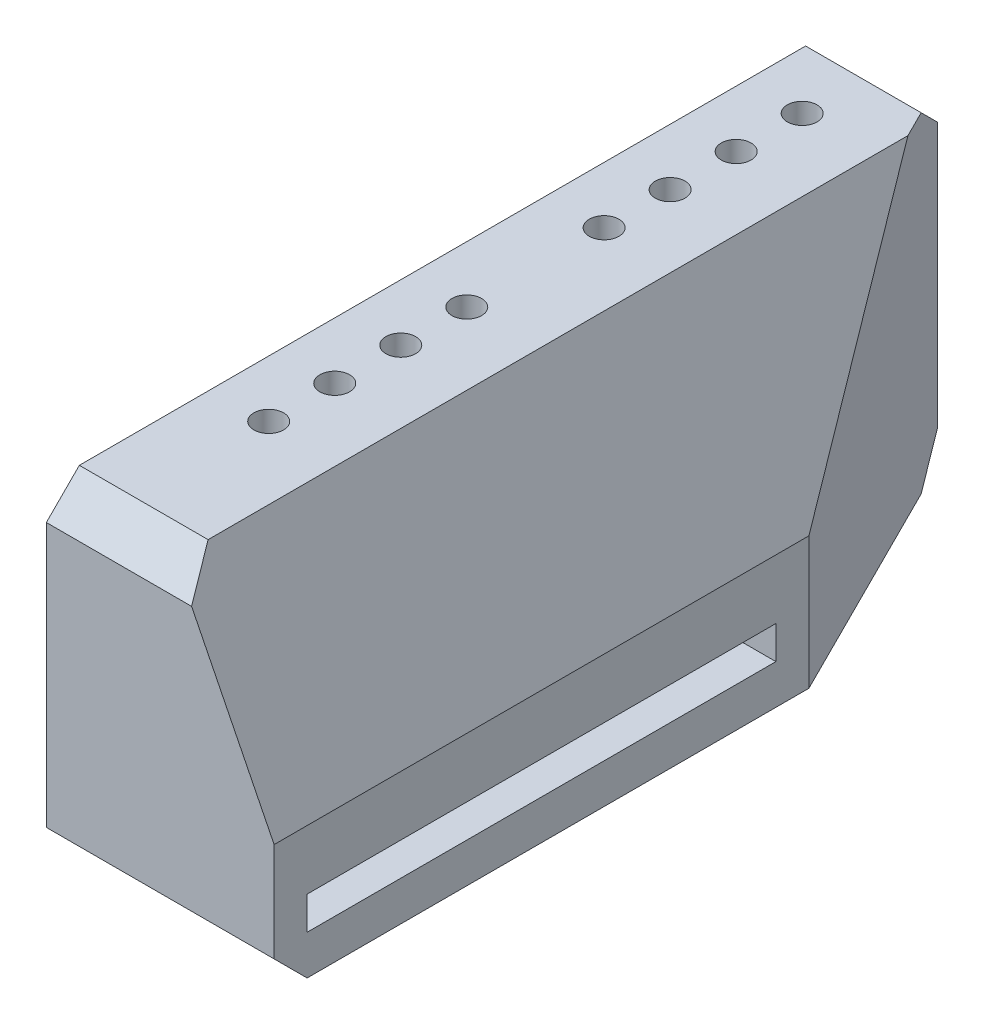
ISO-10303-21;
HEADER;
FILE_DESCRIPTION(('STEP AP214'),'2;1');
FILE_NAME('part.step','',(''),(''),'','','');
FILE_SCHEMA(('AUTOMOTIVE_DESIGN { 1 0 10303 214 1 1 1 1 }'));
ENDSEC;
DATA;
#1=APPLICATION_CONTEXT('core data for automotive mechanical design processes');
#2=APPLICATION_PROTOCOL_DEFINITION('international standard','automotive_design',2000,#1);
#3=PRODUCT_CONTEXT('',#1,'mechanical');
#4=PRODUCT('Part','Part','',(#3));
#5=PRODUCT_RELATED_PRODUCT_CATEGORY('part','',(#4));
#6=PRODUCT_DEFINITION_FORMATION('','',#4);
#7=PRODUCT_DEFINITION_CONTEXT('part definition',#1,'design');
#8=PRODUCT_DEFINITION('design','',#6,#7);
#9=PRODUCT_DEFINITION_SHAPE('','',#8);
#10=(LENGTH_UNIT() NAMED_UNIT(*) SI_UNIT(.MILLI.,.METRE.));
#11=(NAMED_UNIT(*) PLANE_ANGLE_UNIT() SI_UNIT($,.RADIAN.));
#12=(NAMED_UNIT(*) SI_UNIT($,.STERADIAN.) SOLID_ANGLE_UNIT());
#13=UNCERTAINTY_MEASURE_WITH_UNIT(LENGTH_MEASURE(1.E-05),#10,'distance_accuracy_value','');
#14=(GEOMETRIC_REPRESENTATION_CONTEXT(3) GLOBAL_UNCERTAINTY_ASSIGNED_CONTEXT((#13)) GLOBAL_UNIT_ASSIGNED_CONTEXT((#10,
#11,#12)) REPRESENTATION_CONTEXT('',''));
#15=CARTESIAN_POINT('',(0.,0.,0.));
#16=DIRECTION('',(0.,0.,1.));
#17=DIRECTION('',(1.,0.,0.));
#18=AXIS2_PLACEMENT_3D('',#15,#16,#17);
#19=CARTESIAN_POINT('',(8.58000000000001,25.,4.90000000000001));
#20=DIRECTION('',(0.,1.,0.));
#21=DIRECTION('',(0.,0.,1.));
#22=AXIS2_PLACEMENT_3D('',#19,#20,#21);
#23=CYLINDRICAL_SURFACE('',#22,2.24999999999999);
#24=CARTESIAN_POINT('',(8.58000000000001,19.,4.90000000000001));
#25=DIRECTION('',(0.,-1.,0.));
#26=DIRECTION('',(0.,0.,-1.));
#27=AXIS2_PLACEMENT_3D('',#24,#25,#26);
#28=CIRCLE('',#27,2.24999999999999);
#29=CARTESIAN_POINT('',(8.58000000000001,19.,2.65000000000002));
#30=VERTEX_POINT('',#29);
#31=EDGE_CURVE('E327',#30,#30,#28,.F.);
#32=ORIENTED_EDGE('',*,*,#31,.F.);
#33=EDGE_LOOP('',(#32));
#34=FACE_BOUND('',#33,.T.);
#35=CARTESIAN_POINT('',(8.58000000000001,25.,4.90000000000001));
#36=DIRECTION('',(0.,1.,0.));
#37=DIRECTION('',(0.,0.,1.));
#38=AXIS2_PLACEMENT_3D('',#35,#36,#37);
#39=CIRCLE('',#38,2.24999999999999);
#40=CARTESIAN_POINT('',(8.58000000000001,25.,7.15));
#41=VERTEX_POINT('',#40);
#42=EDGE_CURVE('E450',#41,#41,#39,.T.);
#43=ORIENTED_EDGE('',*,*,#42,.T.);
#44=EDGE_LOOP('',(#43));
#45=FACE_BOUND('',#44,.T.);
#46=ADVANCED_FACE('F41',(#34,#45),#23,.F.);
#47=CARTESIAN_POINT('',(8.58000000000001,25.,14.9));
#48=DIRECTION('',(0.,1.,0.));
#49=DIRECTION('',(0.,0.,1.));
#50=AXIS2_PLACEMENT_3D('',#47,#48,#49);
#51=CYLINDRICAL_SURFACE('',#50,2.24999999999999);
#52=CARTESIAN_POINT('',(8.58000000000001,19.,14.9));
#53=DIRECTION('',(0.,-1.,0.));
#54=DIRECTION('',(0.,0.,-1.));
#55=AXIS2_PLACEMENT_3D('',#52,#53,#54);
#56=CIRCLE('',#55,2.24999999999999);
#57=CARTESIAN_POINT('',(8.58000000000001,19.,12.65));
#58=VERTEX_POINT('',#57);
#59=EDGE_CURVE('E323',#58,#58,#56,.F.);
#60=ORIENTED_EDGE('',*,*,#59,.F.);
#61=EDGE_LOOP('',(#60));
#62=FACE_BOUND('',#61,.T.);
#63=CARTESIAN_POINT('',(8.58000000000001,25.,14.9));
#64=DIRECTION('',(0.,1.,0.));
#65=DIRECTION('',(0.,0.,1.));
#66=AXIS2_PLACEMENT_3D('',#63,#64,#65);
#67=CIRCLE('',#66,2.24999999999999);
#68=CARTESIAN_POINT('',(8.58000000000001,25.,17.15));
#69=VERTEX_POINT('',#68);
#70=EDGE_CURVE('E446',#69,#69,#67,.T.);
#71=ORIENTED_EDGE('',*,*,#70,.T.);
#72=EDGE_LOOP('',(#71));
#73=FACE_BOUND('',#72,.T.);
#74=ADVANCED_FACE('F542',(#62,#73),#51,.F.);
#75=CARTESIAN_POINT('',(8.58000000000001,25.,-45.9));
#76=DIRECTION('',(0.,1.,0.));
#77=DIRECTION('',(0.,0.,1.));
#78=AXIS2_PLACEMENT_3D('',#75,#76,#77);
#79=CYLINDRICAL_SURFACE('',#78,2.24999999999999);
#80=CARTESIAN_POINT('',(8.58000000000001,19.,-45.9));
#81=DIRECTION('',(0.,-1.,0.));
#82=DIRECTION('',(0.,0.,-1.));
#83=AXIS2_PLACEMENT_3D('',#80,#81,#82);
#84=CIRCLE('',#83,2.24999999999999);
#85=CARTESIAN_POINT('',(8.58000000000001,19.,-48.15));
#86=VERTEX_POINT('',#85);
#87=EDGE_CURVE('E343',#86,#86,#84,.F.);
#88=ORIENTED_EDGE('',*,*,#87,.F.);
#89=EDGE_LOOP('',(#88));
#90=FACE_BOUND('',#89,.T.);
#91=CARTESIAN_POINT('',(8.58000000000001,25.,-45.9));
#92=DIRECTION('',(0.,1.,0.));
#93=DIRECTION('',(0.,0.,1.));
#94=AXIS2_PLACEMENT_3D('',#91,#92,#93);
#95=CIRCLE('',#94,2.24999999999999);
#96=CARTESIAN_POINT('',(8.58000000000001,25.,-43.65));
#97=VERTEX_POINT('',#96);
#98=EDGE_CURVE('E442',#97,#97,#95,.T.);
#99=ORIENTED_EDGE('',*,*,#98,.T.);
#100=EDGE_LOOP('',(#99));
#101=FACE_BOUND('',#100,.T.);
#102=ADVANCED_FACE('F548',(#90,#101),#79,.F.);
#103=CARTESIAN_POINT('',(8.58000000000001,25.,-35.9));
#104=DIRECTION('',(0.,1.,0.));
#105=DIRECTION('',(0.,0.,1.));
#106=AXIS2_PLACEMENT_3D('',#103,#104,#105);
#107=CYLINDRICAL_SURFACE('',#106,2.24999999999999);
#108=CARTESIAN_POINT('',(8.58000000000001,19.,-35.9));
#109=DIRECTION('',(0.,-1.,0.));
#110=DIRECTION('',(0.,0.,-1.));
#111=AXIS2_PLACEMENT_3D('',#108,#109,#110);
#112=CIRCLE('',#111,2.24999999999999);
#113=CARTESIAN_POINT('',(8.58000000000001,19.,-38.15));
#114=VERTEX_POINT('',#113);
#115=EDGE_CURVE('E339',#114,#114,#112,.F.);
#116=ORIENTED_EDGE('',*,*,#115,.F.);
#117=EDGE_LOOP('',(#116));
#118=FACE_BOUND('',#117,.T.);
#119=CARTESIAN_POINT('',(8.58000000000001,25.,-35.9));
#120=DIRECTION('',(0.,1.,0.));
#121=DIRECTION('',(0.,0.,1.));
#122=AXIS2_PLACEMENT_3D('',#119,#120,#121);
#123=CIRCLE('',#122,2.24999999999999);
#124=CARTESIAN_POINT('',(8.58000000000001,25.,-33.65));
#125=VERTEX_POINT('',#124);
#126=EDGE_CURVE('E207',#125,#125,#123,.T.);
#127=ORIENTED_EDGE('',*,*,#126,.T.);
#128=EDGE_LOOP('',(#127));
#129=FACE_BOUND('',#128,.T.);
#130=ADVANCED_FACE('F721',(#118,#129),#107,.F.);
#131=CARTESIAN_POINT('',(34.5,-25.,60.));
#132=DIRECTION('',(0.,1.,0.));
#133=DIRECTION('',(0.,0.,1.));
#134=AXIS2_PLACEMENT_3D('',#131,#132,#133);
#135=PLANE('',#134);
#136=CARTESIAN_POINT('',(24.5,-25.,50.));
#137=DIRECTION('',(0.,-1.,0.));
#138=DIRECTION('',(0.,0.,-1.));
#139=AXIS2_PLACEMENT_3D('',#136,#137,#138);
#140=CIRCLE('',#139,2.25);
#141=CARTESIAN_POINT('',(24.5,-25.,47.75));
#142=VERTEX_POINT('',#141);
#143=EDGE_CURVE('E363',#142,#142,#140,.T.);
#144=ORIENTED_EDGE('',*,*,#143,.F.);
#145=EDGE_LOOP('',(#144));
#146=FACE_BOUND('',#145,.T.);
#147=DIRECTION('',(0.,0.,-1.));
#148=VECTOR('',#147,1.);
#149=CARTESIAN_POINT('',(34.5,-25.,60.));
#150=LINE('',#149,#148);
#151=CARTESIAN_POINT('',(34.5,-25.,55.));
#152=VERTEX_POINT('',#151);
#153=CARTESIAN_POINT('',(34.5,-25.,-21.));
#154=VERTEX_POINT('',#153);
#155=EDGE_CURVE('E193',#152,#154,#150,.T.);
#156=ORIENTED_EDGE('',*,*,#155,.F.);
#157=DIRECTION('',(-1.,0.,0.));
#158=VECTOR('',#157,1.);
#159=CARTESIAN_POINT('',(34.5,-25.,55.));
#160=LINE('',#159,#158);
#161=CARTESIAN_POINT('',(0.,-25.,55.));
#162=VERTEX_POINT('',#161);
#163=EDGE_CURVE('E468',#152,#162,#160,.T.);
#164=ORIENTED_EDGE('',*,*,#163,.T.);
#165=DIRECTION('',(0.,0.,-1.));
#166=VECTOR('',#165,1.);
#167=CARTESIAN_POINT('',(0.,-25.,60.));
#168=LINE('',#167,#166);
#169=CARTESIAN_POINT('',(0.,-25.,-54.9999999999999));
#170=VERTEX_POINT('',#169);
#171=EDGE_CURVE('E425',#162,#170,#168,.T.);
#172=ORIENTED_EDGE('',*,*,#171,.T.);
#173=DIRECTION('',(1.,0.,0.));
#174=VECTOR('',#173,1.);
#175=CARTESIAN_POINT('',(34.5,-25.,-54.9999999999999));
#176=LINE('',#175,#174);
#177=CARTESIAN_POINT('',(17.5,-25.,-55.));
#178=VERTEX_POINT('',#177);
#179=EDGE_CURVE('E216',#170,#178,#176,.T.);
#180=ORIENTED_EDGE('',*,*,#179,.T.);
#181=DIRECTION('',(0.447213595499958,0.,0.894427190999916));
#182=VECTOR('',#181,1.);
#183=CARTESIAN_POINT('',(36.,-25.,-18.));
#184=LINE('',#183,#182);
#185=EDGE_CURVE('E211',#178,#154,#184,.T.);
#186=ORIENTED_EDGE('',*,*,#185,.T.);
#187=EDGE_LOOP('',(#156,#164,#172,#180,#186));
#188=FACE_BOUND('',#187,.T.);
#189=CARTESIAN_POINT('',(24.5,-25.,-9.99999999999999));
#190=DIRECTION('',(0.,-1.,0.));
#191=DIRECTION('',(0.,0.,-1.));
#192=AXIS2_PLACEMENT_3D('',#189,#190,#191);
#193=CIRCLE('',#192,2.25);
#194=CARTESIAN_POINT('',(24.5,-25.,-12.25));
#195=VERTEX_POINT('',#194);
#196=EDGE_CURVE('E371',#195,#195,#193,.T.);
#197=ORIENTED_EDGE('',*,*,#196,.F.);
#198=EDGE_LOOP('',(#197));
#199=FACE_BOUND('',#198,.T.);
#200=ADVANCED_FACE('F212',(#146,#188,#199),#135,.F.);
#201=CARTESIAN_POINT('',(34.5,-25.,-60.));
#202=DIRECTION('',(0.,0.,1.));
#203=DIRECTION('',(1.,0.,0.));
#204=AXIS2_PLACEMENT_3D('',#201,#202,#203);
#205=PLANE('',#204);
#206=DIRECTION('',(0.,1.,0.));
#207=VECTOR('',#206,1.);
#208=CARTESIAN_POINT('',(15.,-25.,-60.));
#209=LINE('',#208,#207);
#210=CARTESIAN_POINT('',(15.,-20.,-60.));
#211=VERTEX_POINT('',#210);
#212=CARTESIAN_POINT('',(15.,20.,-60.));
#213=VERTEX_POINT('',#212);
#214=EDGE_CURVE('E219',#211,#213,#209,.T.);
#215=ORIENTED_EDGE('',*,*,#214,.F.);
#216=DIRECTION('',(-1.,0.,0.));
#217=VECTOR('',#216,1.);
#218=CARTESIAN_POINT('',(34.5,-20.,-60.));
#219=LINE('',#218,#217);
#220=CARTESIAN_POINT('',(0.,-20.,-60.));
#221=VERTEX_POINT('',#220);
#222=EDGE_CURVE('E495',#211,#221,#219,.T.);
#223=ORIENTED_EDGE('',*,*,#222,.T.);
#224=DIRECTION('',(0.,1.,0.));
#225=VECTOR('',#224,1.);
#226=CARTESIAN_POINT('',(0.,-25.,-60.));
#227=LINE('',#226,#225);
#228=CARTESIAN_POINT('',(0.,20.,-60.));
#229=VERTEX_POINT('',#228);
#230=EDGE_CURVE('E414',#221,#229,#227,.T.);
#231=ORIENTED_EDGE('',*,*,#230,.T.);
#232=DIRECTION('',(1.,0.,0.));
#233=VECTOR('',#232,1.);
#234=CARTESIAN_POINT('',(34.5,20.,-60.));
#235=LINE('',#234,#233);
#236=EDGE_CURVE('E492',#229,#213,#235,.T.);
#237=ORIENTED_EDGE('',*,*,#236,.T.);
#238=EDGE_LOOP('',(#215,#223,#231,#237));
#239=FACE_BOUND('',#238,.T.);
#240=ADVANCED_FACE('F535',(#239),#205,.F.);
#241=CARTESIAN_POINT('',(34.5,25.,60.));
#242=DIRECTION('',(0.,-1.,0.));
#243=DIRECTION('',(0.,0.,-1.));
#244=AXIS2_PLACEMENT_3D('',#241,#242,#243);
#245=PLANE('',#244);
#246=CARTESIAN_POINT('',(8.58000000000001,25.,24.9));
#247=DIRECTION('',(0.,1.,0.));
#248=DIRECTION('',(0.,0.,1.));
#249=AXIS2_PLACEMENT_3D('',#246,#247,#248);
#250=CIRCLE('',#249,2.24999999999999);
#251=CARTESIAN_POINT('',(8.58000000000001,25.,27.15));
#252=VERTEX_POINT('',#251);
#253=EDGE_CURVE('E347',#252,#252,#250,.T.);
#254=ORIENTED_EDGE('',*,*,#253,.F.);
#255=EDGE_LOOP('',(#254));
#256=FACE_BOUND('',#255,.T.);
#257=CARTESIAN_POINT('',(8.58000000000001,25.,-25.9));
#258=DIRECTION('',(0.,1.,0.));
#259=DIRECTION('',(0.,0.,1.));
#260=AXIS2_PLACEMENT_3D('',#257,#258,#259);
#261=CIRCLE('',#260,2.24999999999999);
#262=CARTESIAN_POINT('',(8.58000000000001,25.,-23.65));
#263=VERTEX_POINT('',#262);
#264=EDGE_CURVE('E351',#263,#263,#261,.T.);
#265=ORIENTED_EDGE('',*,*,#264,.F.);
#266=EDGE_LOOP('',(#265));
#267=FACE_BOUND('',#266,.T.);
#268=CARTESIAN_POINT('',(8.58000000000001,25.,-15.9));
#269=DIRECTION('',(0.,1.,0.));
#270=DIRECTION('',(0.,0.,1.));
#271=AXIS2_PLACEMENT_3D('',#268,#269,#270);
#272=CIRCLE('',#271,2.24999999999999);
#273=CARTESIAN_POINT('',(8.58000000000001,25.,-13.65));
#274=VERTEX_POINT('',#273);
#275=EDGE_CURVE('E355',#274,#274,#272,.T.);
#276=ORIENTED_EDGE('',*,*,#275,.F.);
#277=EDGE_LOOP('',(#276));
#278=FACE_BOUND('',#277,.T.);
#279=CARTESIAN_POINT('',(8.58000000000001,25.,34.9));
#280=DIRECTION('',(0.,1.,0.));
#281=DIRECTION('',(0.,0.,1.));
#282=AXIS2_PLACEMENT_3D('',#279,#280,#281);
#283=CIRCLE('',#282,2.24999999999999);
#284=CARTESIAN_POINT('',(8.58000000000001,25.,37.15));
#285=VERTEX_POINT('',#284);
#286=EDGE_CURVE('E359',#285,#285,#283,.T.);
#287=ORIENTED_EDGE('',*,*,#286,.F.);
#288=EDGE_LOOP('',(#287));
#289=FACE_BOUND('',#288,.T.);
#290=DIRECTION('',(0.,0.,1.));
#291=VECTOR('',#290,1.);
#292=CARTESIAN_POINT('',(0.,25.,60.));
#293=LINE('',#292,#291);
#294=CARTESIAN_POINT('',(0.,25.,-55.));
#295=VERTEX_POINT('',#294);
#296=CARTESIAN_POINT('',(0.,25.,55.));
#297=VERTEX_POINT('',#296);
#298=EDGE_CURVE('E430',#295,#297,#293,.T.);
#299=ORIENTED_EDGE('',*,*,#298,.T.);
#300=DIRECTION('',(1.,0.,0.));
#301=VECTOR('',#300,1.);
#302=CARTESIAN_POINT('',(34.5,25.,55.));
#303=LINE('',#302,#301);
#304=CARTESIAN_POINT('',(19.5,25.,55.));
#305=VERTEX_POINT('',#304);
#306=EDGE_CURVE('E51',#297,#305,#303,.T.);
#307=ORIENTED_EDGE('',*,*,#306,.T.);
#308=DIRECTION('',(0.,0.,-1.));
#309=VECTOR('',#308,1.);
#310=CARTESIAN_POINT('',(19.5,25.,60.));
#311=LINE('',#310,#309);
#312=CARTESIAN_POINT('',(19.5,25.,-51.));
#313=VERTEX_POINT('',#312);
#314=EDGE_CURVE('E461',#305,#313,#311,.T.);
#315=ORIENTED_EDGE('',*,*,#314,.T.);
#316=DIRECTION('',(0.447213595499958,0.,0.894427190999916));
#317=VECTOR('',#316,1.);
#318=CARTESIAN_POINT('',(36.,25.,-18.));
#319=LINE('',#318,#317);
#320=CARTESIAN_POINT('',(17.5,25.,-55.));
#321=VERTEX_POINT('',#320);
#322=EDGE_CURVE('E220',#321,#313,#319,.T.);
#323=ORIENTED_EDGE('',*,*,#322,.F.);
#324=DIRECTION('',(-1.,0.,0.));
#325=VECTOR('',#324,1.);
#326=CARTESIAN_POINT('',(34.5,25.,-55.));
#327=LINE('',#326,#325);
#328=EDGE_CURVE('E504',#321,#295,#327,.T.);
#329=ORIENTED_EDGE('',*,*,#328,.T.);
#330=EDGE_LOOP('',(#299,#307,#315,#323,#329));
#331=FACE_BOUND('',#330,.T.);
#332=ORIENTED_EDGE('',*,*,#126,.F.);
#333=EDGE_LOOP('',(#332));
#334=FACE_BOUND('',#333,.T.);
#335=ORIENTED_EDGE('',*,*,#98,.F.);
#336=EDGE_LOOP('',(#335));
#337=FACE_BOUND('',#336,.T.);
#338=ORIENTED_EDGE('',*,*,#70,.F.);
#339=EDGE_LOOP('',(#338));
#340=FACE_BOUND('',#339,.T.);
#341=ORIENTED_EDGE('',*,*,#42,.F.);
#342=EDGE_LOOP('',(#341));
#343=FACE_BOUND('',#342,.T.);
#344=ADVANCED_FACE('F510',(#256,#267,#278,#289,#331,#334,#337,#340,#343),#245,.F.);
#345=CARTESIAN_POINT('',(34.5,-25.,60.));
#346=DIRECTION('',(0.,0.,-1.));
#347=DIRECTION('',(-1.,0.,0.));
#348=AXIS2_PLACEMENT_3D('',#345,#346,#347);
#349=PLANE('',#348);
#350=DIRECTION('',(0.,-1.,0.));
#351=VECTOR('',#350,1.);
#352=CARTESIAN_POINT('',(0.,-25.,60.));
#353=LINE('',#352,#351);
#354=CARTESIAN_POINT('',(0.,20.,60.));
#355=VERTEX_POINT('',#354);
#356=CARTESIAN_POINT('',(0.,-20.,60.));
#357=VERTEX_POINT('',#356);
#358=EDGE_CURVE('E433',#355,#357,#353,.T.);
#359=ORIENTED_EDGE('',*,*,#358,.T.);
#360=DIRECTION('',(1.,0.,0.));
#361=VECTOR('',#360,1.);
#362=CARTESIAN_POINT('',(34.5,-20.,60.));
#363=LINE('',#362,#361);
#364=CARTESIAN_POINT('',(34.5,-20.,60.));
#365=VERTEX_POINT('',#364);
#366=EDGE_CURVE('E487',#357,#365,#363,.T.);
#367=ORIENTED_EDGE('',*,*,#366,.T.);
#368=DIRECTION('',(0.,-1.,0.));
#369=VECTOR('',#368,1.);
#370=CARTESIAN_POINT('',(34.5,-25.,60.));
#371=LINE('',#370,#369);
#372=CARTESIAN_POINT('',(34.5,-5.00000000000021,60.));
#373=VERTEX_POINT('',#372);
#374=EDGE_CURVE('E208',#373,#365,#371,.T.);
#375=ORIENTED_EDGE('',*,*,#374,.F.);
#376=DIRECTION('',(0.447213595499956,-0.894427190999917,0.));
#377=VECTOR('',#376,1.);
#378=CARTESIAN_POINT('',(34.5,-5.00000000000021,60.));
#379=LINE('',#378,#377);
#380=CARTESIAN_POINT('',(22.,20.,60.));
#381=VERTEX_POINT('',#380);
#382=EDGE_CURVE('E457',#373,#381,#379,.F.);
#383=ORIENTED_EDGE('',*,*,#382,.T.);
#384=DIRECTION('',(-1.,0.,0.));
#385=VECTOR('',#384,1.);
#386=CARTESIAN_POINT('',(34.5,20.,60.));
#387=LINE('',#386,#385);
#388=EDGE_CURVE('E483',#381,#355,#387,.T.);
#389=ORIENTED_EDGE('',*,*,#388,.T.);
#390=EDGE_LOOP('',(#359,#367,#375,#383,#389));
#391=FACE_BOUND('',#390,.T.);
#392=ADVANCED_FACE('F523',(#391),#349,.F.);
#393=CARTESIAN_POINT('',(34.5,0.,0.));
#394=DIRECTION('',(-1.,0.,0.));
#395=DIRECTION('',(0.,0.,1.));
#396=AXIS2_PLACEMENT_3D('',#393,#394,#395);
#397=PLANE('',#396);
#398=DIRECTION('',(0.,0.,1.));
#399=VECTOR('',#398,1.);
#400=CARTESIAN_POINT('',(34.5,-14.,55.));
#401=LINE('',#400,#399);
#402=CARTESIAN_POINT('',(34.5,-14.,-16.));
#403=VERTEX_POINT('',#402);
#404=CARTESIAN_POINT('',(34.5,-14.,55.));
#405=VERTEX_POINT('',#404);
#406=EDGE_CURVE('E400',#403,#405,#401,.T.);
#407=ORIENTED_EDGE('',*,*,#406,.F.);
#408=DIRECTION('',(0.,1.,0.));
#409=VECTOR('',#408,1.);
#410=CARTESIAN_POINT('',(34.5,-19.,-16.));
#411=LINE('',#410,#409);
#412=CARTESIAN_POINT('',(34.5,-19.,-16.));
#413=VERTEX_POINT('',#412);
#414=EDGE_CURVE('E379',#413,#403,#411,.T.);
#415=ORIENTED_EDGE('',*,*,#414,.F.);
#416=DIRECTION('',(0.,0.,-1.));
#417=VECTOR('',#416,1.);
#418=CARTESIAN_POINT('',(34.5,-19.,55.));
#419=LINE('',#418,#417);
#420=CARTESIAN_POINT('',(34.5,-19.,55.));
#421=VERTEX_POINT('',#420);
#422=EDGE_CURVE('E385',#421,#413,#419,.T.);
#423=ORIENTED_EDGE('',*,*,#422,.F.);
#424=DIRECTION('',(0.,-1.,0.));
#425=VECTOR('',#424,1.);
#426=CARTESIAN_POINT('',(34.5,-19.,55.));
#427=LINE('',#426,#425);
#428=EDGE_CURVE('E404',#405,#421,#427,.T.);
#429=ORIENTED_EDGE('',*,*,#428,.F.);
#430=EDGE_LOOP('',(#407,#415,#423,#429));
#431=FACE_BOUND('',#430,.T.);
#432=ORIENTED_EDGE('',*,*,#374,.T.);
#433=DIRECTION('',(0.,0.707106781186549,0.707106781186546));
#434=VECTOR('',#433,1.);
#435=CARTESIAN_POINT('',(34.5,-25.,55.));
#436=LINE('',#435,#434);
#437=EDGE_CURVE('E202',#365,#152,#436,.F.);
#438=ORIENTED_EDGE('',*,*,#437,.T.);
#439=ORIENTED_EDGE('',*,*,#155,.T.);
#440=DIRECTION('',(0.,1.,0.));
#441=VECTOR('',#440,1.);
#442=CARTESIAN_POINT('',(34.5,-25.,-21.));
#443=LINE('',#442,#441);
#444=CARTESIAN_POINT('',(34.5,-5.00000000000021,-21.));
#445=VERTEX_POINT('',#444);
#446=EDGE_CURVE('E199',#154,#445,#443,.T.);
#447=ORIENTED_EDGE('',*,*,#446,.T.);
#448=DIRECTION('',(0.,0.,1.));
#449=VECTOR('',#448,1.);
#450=CARTESIAN_POINT('',(34.5,-5.00000000000021,0.));
#451=LINE('',#450,#449);
#452=EDGE_CURVE('E454',#445,#373,#451,.T.);
#453=ORIENTED_EDGE('',*,*,#452,.T.);
#454=EDGE_LOOP('',(#432,#438,#439,#447,#453));
#455=FACE_BOUND('',#454,.T.);
#456=ADVANCED_FACE('F196',(#431,#455),#397,.F.);
#457=CARTESIAN_POINT('',(0.,0.,0.));
#458=DIRECTION('',(-1.,0.,0.));
#459=DIRECTION('',(0.,0.,1.));
#460=AXIS2_PLACEMENT_3D('',#457,#458,#459);
#461=PLANE('',#460);
#462=DIRECTION('',(0.,0.,1.));
#463=VECTOR('',#462,1.);
#464=CARTESIAN_POINT('',(0.,14.,0.));
#465=LINE('',#464,#463);
#466=CARTESIAN_POINT('',(0.,14.,-51.4));
#467=VERTEX_POINT('',#466);
#468=CARTESIAN_POINT('',(0.,14.,-10.4));
#469=VERTEX_POINT('',#468);
#470=EDGE_CURVE('E251',#467,#469,#465,.T.);
#471=ORIENTED_EDGE('',*,*,#470,.F.);
#472=DIRECTION('',(0.,1.,0.));
#473=VECTOR('',#472,1.);
#474=CARTESIAN_POINT('',(0.,0.,-51.4));
#475=LINE('',#474,#473);
#476=CARTESIAN_POINT('',(0.,19.,-51.4));
#477=VERTEX_POINT('',#476);
#478=EDGE_CURVE('E240',#467,#477,#475,.T.);
#479=ORIENTED_EDGE('',*,*,#478,.T.);
#480=DIRECTION('',(0.,0.,1.));
#481=VECTOR('',#480,1.);
#482=CARTESIAN_POINT('',(0.,19.,0.));
#483=LINE('',#482,#481);
#484=CARTESIAN_POINT('',(0.,19.,-10.4));
#485=VERTEX_POINT('',#484);
#486=EDGE_CURVE('E259',#477,#485,#483,.T.);
#487=ORIENTED_EDGE('',*,*,#486,.T.);
#488=DIRECTION('',(0.,1.,0.));
#489=VECTOR('',#488,1.);
#490=CARTESIAN_POINT('',(0.,0.,-10.4));
#491=LINE('',#490,#489);
#492=EDGE_CURVE('E254',#469,#485,#491,.T.);
#493=ORIENTED_EDGE('',*,*,#492,.F.);
#494=EDGE_LOOP('',(#471,#479,#487,#493));
#495=FACE_BOUND('',#494,.T.);
#496=DIRECTION('',(0.,0.,1.));
#497=VECTOR('',#496,1.);
#498=CARTESIAN_POINT('',(0.,14.,0.));
#499=LINE('',#498,#497);
#500=CARTESIAN_POINT('',(0.,14.,-0.599999999999989));
#501=VERTEX_POINT('',#500);
#502=CARTESIAN_POINT('',(0.,14.,40.4));
#503=VERTEX_POINT('',#502);
#504=EDGE_CURVE('E226',#501,#503,#499,.T.);
#505=ORIENTED_EDGE('',*,*,#504,.F.);
#506=DIRECTION('',(0.,1.,0.));
#507=VECTOR('',#506,1.);
#508=CARTESIAN_POINT('',(0.,0.,-0.599999999999989));
#509=LINE('',#508,#507);
#510=CARTESIAN_POINT('',(0.,19.,-0.599999999999989));
#511=VERTEX_POINT('',#510);
#512=EDGE_CURVE('E284',#501,#511,#509,.T.);
#513=ORIENTED_EDGE('',*,*,#512,.T.);
#514=DIRECTION('',(0.,0.,1.));
#515=VECTOR('',#514,1.);
#516=CARTESIAN_POINT('',(0.,19.,0.));
#517=LINE('',#516,#515);
#518=CARTESIAN_POINT('',(0.,19.,40.4));
#519=VERTEX_POINT('',#518);
#520=EDGE_CURVE('E298',#511,#519,#517,.T.);
#521=ORIENTED_EDGE('',*,*,#520,.T.);
#522=DIRECTION('',(0.,1.,0.));
#523=VECTOR('',#522,1.);
#524=CARTESIAN_POINT('',(0.,0.,40.4));
#525=LINE('',#524,#523);
#526=EDGE_CURVE('E230',#503,#519,#525,.T.);
#527=ORIENTED_EDGE('',*,*,#526,.F.);
#528=EDGE_LOOP('',(#505,#513,#521,#527));
#529=FACE_BOUND('',#528,.T.);
#530=ORIENTED_EDGE('',*,*,#171,.F.);
#531=DIRECTION('',(0.,-0.707106781186549,-0.707106781186546));
#532=VECTOR('',#531,1.);
#533=CARTESIAN_POINT('',(0.,-40.,40.0000000000002));
#534=LINE('',#533,#532);
#535=EDGE_CURVE('E480',#162,#357,#534,.F.);
#536=ORIENTED_EDGE('',*,*,#535,.T.);
#537=ORIENTED_EDGE('',*,*,#358,.F.);
#538=DIRECTION('',(0.,-0.707106781186547,0.707106781186549));
#539=VECTOR('',#538,1.);
#540=CARTESIAN_POINT('',(0.,40.,39.9999999999999));
#541=LINE('',#540,#539);
#542=EDGE_CURVE('E474',#355,#297,#541,.F.);
#543=ORIENTED_EDGE('',*,*,#542,.T.);
#544=ORIENTED_EDGE('',*,*,#298,.F.);
#545=DIRECTION('',(0.,0.707106781186549,0.707106781186547));
#546=VECTOR('',#545,1.);
#547=CARTESIAN_POINT('',(0.,40.,-40.0000000000001));
#548=LINE('',#547,#546);
#549=EDGE_CURVE('E471',#295,#229,#548,.F.);
#550=ORIENTED_EDGE('',*,*,#549,.T.);
#551=ORIENTED_EDGE('',*,*,#230,.F.);
#552=DIRECTION('',(0.,0.707106781186547,-0.707106781186549));
#553=VECTOR('',#552,1.);
#554=CARTESIAN_POINT('',(0.,-40.,-39.9999999999999));
#555=LINE('',#554,#553);
#556=EDGE_CURVE('E477',#221,#170,#555,.F.);
#557=ORIENTED_EDGE('',*,*,#556,.T.);
#558=EDGE_LOOP('',(#530,#536,#537,#543,#544,#550,#551,#557));
#559=FACE_BOUND('',#558,.T.);
#560=ADVANCED_FACE('F515',(#495,#529,#559),#461,.T.);
#561=CARTESIAN_POINT('',(18.5,-19.,-16.));
#562=DIRECTION('',(0.,0.,-1.));
#563=DIRECTION('',(-1.,0.,0.));
#564=AXIS2_PLACEMENT_3D('',#561,#562,#563);
#565=PLANE('',#564);
#566=ORIENTED_EDGE('',*,*,#414,.T.);
#567=DIRECTION('',(1.,0.,0.));
#568=VECTOR('',#567,1.);
#569=CARTESIAN_POINT('',(18.5,-14.,-16.));
#570=LINE('',#569,#568);
#571=CARTESIAN_POINT('',(18.5,-14.,-16.));
#572=VERTEX_POINT('',#571);
#573=EDGE_CURVE('E397',#572,#403,#570,.T.);
#574=ORIENTED_EDGE('',*,*,#573,.F.);
#575=DIRECTION('',(0.,1.,0.));
#576=VECTOR('',#575,1.);
#577=CARTESIAN_POINT('',(18.5,-19.,-16.));
#578=LINE('',#577,#576);
#579=CARTESIAN_POINT('',(18.5,-19.,-16.));
#580=VERTEX_POINT('',#579);
#581=EDGE_CURVE('E380',#580,#572,#578,.T.);
#582=ORIENTED_EDGE('',*,*,#581,.F.);
#583=DIRECTION('',(1.,0.,0.));
#584=VECTOR('',#583,1.);
#585=CARTESIAN_POINT('',(18.5,-19.,-16.));
#586=LINE('',#585,#584);
#587=EDGE_CURVE('E411',#580,#413,#586,.T.);
#588=ORIENTED_EDGE('',*,*,#587,.T.);
#589=EDGE_LOOP('',(#566,#574,#582,#588));
#590=FACE_BOUND('',#589,.T.);
#591=ADVANCED_FACE('F822',(#590),#565,.F.);
#592=CARTESIAN_POINT('',(18.5,-19.,55.));
#593=DIRECTION('',(0.,-1.,0.));
#594=DIRECTION('',(0.,0.,-1.));
#595=AXIS2_PLACEMENT_3D('',#592,#593,#594);
#596=PLANE('',#595);
#597=CARTESIAN_POINT('',(24.5,-19.,50.));
#598=DIRECTION('',(0.,-1.,0.));
#599=DIRECTION('',(0.,0.,-1.));
#600=AXIS2_PLACEMENT_3D('',#597,#598,#599);
#601=CIRCLE('',#600,2.25);
#602=CARTESIAN_POINT('',(24.5,-19.,47.75));
#603=VERTEX_POINT('',#602);
#604=EDGE_CURVE('E367',#603,#603,#601,.T.);
#605=ORIENTED_EDGE('',*,*,#604,.T.);
#606=EDGE_LOOP('',(#605));
#607=FACE_BOUND('',#606,.T.);
#608=CARTESIAN_POINT('',(24.5,-19.,-9.99999999999999));
#609=DIRECTION('',(0.,-1.,0.));
#610=DIRECTION('',(0.,0.,-1.));
#611=AXIS2_PLACEMENT_3D('',#608,#609,#610);
#612=CIRCLE('',#611,2.25);
#613=CARTESIAN_POINT('',(24.5,-19.,-12.25));
#614=VERTEX_POINT('',#613);
#615=EDGE_CURVE('E375',#614,#614,#612,.T.);
#616=ORIENTED_EDGE('',*,*,#615,.T.);
#617=EDGE_LOOP('',(#616));
#618=FACE_BOUND('',#617,.T.);
#619=ORIENTED_EDGE('',*,*,#422,.T.);
#620=ORIENTED_EDGE('',*,*,#587,.F.);
#621=DIRECTION('',(0.,0.,-1.));
#622=VECTOR('',#621,1.);
#623=CARTESIAN_POINT('',(18.5,-19.,55.));
#624=LINE('',#623,#622);
#625=CARTESIAN_POINT('',(18.5,-19.,55.));
#626=VERTEX_POINT('',#625);
#627=EDGE_CURVE('E393',#626,#580,#624,.T.);
#628=ORIENTED_EDGE('',*,*,#627,.F.);
#629=DIRECTION('',(1.,0.,0.));
#630=VECTOR('',#629,1.);
#631=CARTESIAN_POINT('',(18.5,-19.,55.));
#632=LINE('',#631,#630);
#633=EDGE_CURVE('E415',#626,#421,#632,.T.);
#634=ORIENTED_EDGE('',*,*,#633,.T.);
#635=EDGE_LOOP('',(#619,#620,#628,#634));
#636=FACE_BOUND('',#635,.T.);
#637=ADVANCED_FACE('F813',(#607,#618,#636),#596,.F.);
#638=CARTESIAN_POINT('',(18.5,-19.,55.));
#639=DIRECTION('',(0.,0.,1.));
#640=DIRECTION('',(1.,0.,0.));
#641=AXIS2_PLACEMENT_3D('',#638,#639,#640);
#642=PLANE('',#641);
#643=ORIENTED_EDGE('',*,*,#428,.T.);
#644=ORIENTED_EDGE('',*,*,#633,.F.);
#645=DIRECTION('',(0.,-1.,0.));
#646=VECTOR('',#645,1.);
#647=CARTESIAN_POINT('',(18.5,-19.,55.));
#648=LINE('',#647,#646);
#649=CARTESIAN_POINT('',(18.5,-14.,55.));
#650=VERTEX_POINT('',#649);
#651=EDGE_CURVE('E389',#650,#626,#648,.T.);
#652=ORIENTED_EDGE('',*,*,#651,.F.);
#653=DIRECTION('',(1.,0.,0.));
#654=VECTOR('',#653,1.);
#655=CARTESIAN_POINT('',(18.5,-14.,55.));
#656=LINE('',#655,#654);
#657=EDGE_CURVE('E418',#650,#405,#656,.T.);
#658=ORIENTED_EDGE('',*,*,#657,.T.);
#659=EDGE_LOOP('',(#643,#644,#652,#658));
#660=FACE_BOUND('',#659,.T.);
#661=ADVANCED_FACE('F804',(#660),#642,.F.);
#662=CARTESIAN_POINT('',(18.5,-14.,55.));
#663=DIRECTION('',(0.,1.,0.));
#664=DIRECTION('',(0.,0.,1.));
#665=AXIS2_PLACEMENT_3D('',#662,#663,#664);
#666=PLANE('',#665);
#667=ORIENTED_EDGE('',*,*,#406,.T.);
#668=ORIENTED_EDGE('',*,*,#657,.F.);
#669=DIRECTION('',(0.,0.,1.));
#670=VECTOR('',#669,1.);
#671=CARTESIAN_POINT('',(18.5,-14.,55.));
#672=LINE('',#671,#670);
#673=EDGE_CURVE('E384',#572,#650,#672,.T.);
#674=ORIENTED_EDGE('',*,*,#673,.F.);
#675=ORIENTED_EDGE('',*,*,#573,.T.);
#676=EDGE_LOOP('',(#667,#668,#674,#675));
#677=FACE_BOUND('',#676,.T.);
#678=ADVANCED_FACE('F795',(#677),#666,.F.);
#679=CARTESIAN_POINT('',(18.5,0.,0.));
#680=DIRECTION('',(-1.,0.,0.));
#681=DIRECTION('',(0.,0.,1.));
#682=AXIS2_PLACEMENT_3D('',#679,#680,#681);
#683=PLANE('',#682);
#684=ORIENTED_EDGE('',*,*,#581,.T.);
#685=ORIENTED_EDGE('',*,*,#673,.T.);
#686=ORIENTED_EDGE('',*,*,#651,.T.);
#687=ORIENTED_EDGE('',*,*,#627,.T.);
#688=EDGE_LOOP('',(#684,#685,#686,#687));
#689=FACE_BOUND('',#688,.T.);
#690=ADVANCED_FACE('F777',(#689),#683,.F.);
#691=CARTESIAN_POINT('',(24.5,-25.,-9.99999999999999));
#692=DIRECTION('',(0.,-1.,0.));
#693=DIRECTION('',(0.,0.,-1.));
#694=AXIS2_PLACEMENT_3D('',#691,#692,#693);
#695=CYLINDRICAL_SURFACE('',#694,2.25);
#696=ORIENTED_EDGE('',*,*,#615,.F.);
#697=EDGE_LOOP('',(#696));
#698=FACE_BOUND('',#697,.T.);
#699=ORIENTED_EDGE('',*,*,#196,.T.);
#700=EDGE_LOOP('',(#699));
#701=FACE_BOUND('',#700,.T.);
#702=ADVANCED_FACE('F768',(#698,#701),#695,.F.);
#703=CARTESIAN_POINT('',(24.5,-25.,50.));
#704=DIRECTION('',(0.,-1.,0.));
#705=DIRECTION('',(0.,0.,-1.));
#706=AXIS2_PLACEMENT_3D('',#703,#704,#705);
#707=CYLINDRICAL_SURFACE('',#706,2.25);
#708=ORIENTED_EDGE('',*,*,#604,.F.);
#709=EDGE_LOOP('',(#708));
#710=FACE_BOUND('',#709,.T.);
#711=ORIENTED_EDGE('',*,*,#143,.T.);
#712=EDGE_LOOP('',(#711));
#713=FACE_BOUND('',#712,.T.);
#714=ADVANCED_FACE('F759',(#710,#713),#707,.F.);
#715=CARTESIAN_POINT('',(8.58000000000001,25.,34.9));
#716=DIRECTION('',(0.,1.,0.));
#717=DIRECTION('',(0.,0.,1.));
#718=AXIS2_PLACEMENT_3D('',#715,#716,#717);
#719=CYLINDRICAL_SURFACE('',#718,2.24999999999999);
#720=CARTESIAN_POINT('',(8.58000000000001,19.,34.9));
#721=DIRECTION('',(0.,-1.,0.));
#722=DIRECTION('',(0.,0.,-1.));
#723=AXIS2_PLACEMENT_3D('',#720,#721,#722);
#724=CIRCLE('',#723,2.24999999999999);
#725=CARTESIAN_POINT('',(8.58000000000001,19.,32.65));
#726=VERTEX_POINT('',#725);
#727=EDGE_CURVE('E319',#726,#726,#724,.F.);
#728=ORIENTED_EDGE('',*,*,#727,.F.);
#729=EDGE_LOOP('',(#728));
#730=FACE_BOUND('',#729,.T.);
#731=ORIENTED_EDGE('',*,*,#286,.T.);
#732=EDGE_LOOP('',(#731));
#733=FACE_BOUND('',#732,.T.);
#734=ADVANCED_FACE('F750',(#730,#733),#719,.F.);
#735=CARTESIAN_POINT('',(8.58000000000001,25.,-15.9));
#736=DIRECTION('',(0.,1.,0.));
#737=DIRECTION('',(0.,0.,1.));
#738=AXIS2_PLACEMENT_3D('',#735,#736,#737);
#739=CYLINDRICAL_SURFACE('',#738,2.24999999999999);
#740=CARTESIAN_POINT('',(8.58000000000001,19.,-15.9));
#741=DIRECTION('',(0.,-1.,0.));
#742=DIRECTION('',(0.,0.,-1.));
#743=AXIS2_PLACEMENT_3D('',#740,#741,#742);
#744=CIRCLE('',#743,2.24999999999999);
#745=CARTESIAN_POINT('',(8.58000000000001,19.,-18.15));
#746=VERTEX_POINT('',#745);
#747=EDGE_CURVE('E335',#746,#746,#744,.F.);
#748=ORIENTED_EDGE('',*,*,#747,.F.);
#749=EDGE_LOOP('',(#748));
#750=FACE_BOUND('',#749,.T.);
#751=ORIENTED_EDGE('',*,*,#275,.T.);
#752=EDGE_LOOP('',(#751));
#753=FACE_BOUND('',#752,.T.);
#754=ADVANCED_FACE('F716',(#750,#753),#739,.F.);
#755=CARTESIAN_POINT('',(8.58000000000001,25.,-25.9));
#756=DIRECTION('',(0.,1.,0.));
#757=DIRECTION('',(0.,0.,1.));
#758=AXIS2_PLACEMENT_3D('',#755,#756,#757);
#759=CYLINDRICAL_SURFACE('',#758,2.24999999999999);
#760=CARTESIAN_POINT('',(8.58000000000001,19.,-25.9));
#761=DIRECTION('',(0.,-1.,0.));
#762=DIRECTION('',(0.,0.,-1.));
#763=AXIS2_PLACEMENT_3D('',#760,#761,#762);
#764=CIRCLE('',#763,2.24999999999999);
#765=CARTESIAN_POINT('',(8.58000000000001,19.,-28.15));
#766=VERTEX_POINT('',#765);
#767=EDGE_CURVE('E331',#766,#766,#764,.F.);
#768=ORIENTED_EDGE('',*,*,#767,.F.);
#769=EDGE_LOOP('',(#768));
#770=FACE_BOUND('',#769,.T.);
#771=ORIENTED_EDGE('',*,*,#264,.T.);
#772=EDGE_LOOP('',(#771));
#773=FACE_BOUND('',#772,.T.);
#774=ADVANCED_FACE('F707',(#770,#773),#759,.F.);
#775=CARTESIAN_POINT('',(8.58000000000001,25.,24.9));
#776=DIRECTION('',(0.,1.,0.));
#777=DIRECTION('',(0.,0.,1.));
#778=AXIS2_PLACEMENT_3D('',#775,#776,#777);
#779=CYLINDRICAL_SURFACE('',#778,2.24999999999999);
#780=CARTESIAN_POINT('',(8.58000000000001,19.,24.9));
#781=DIRECTION('',(0.,-1.,0.));
#782=DIRECTION('',(0.,0.,-1.));
#783=AXIS2_PLACEMENT_3D('',#780,#781,#782);
#784=CIRCLE('',#783,2.24999999999999);
#785=CARTESIAN_POINT('',(8.58000000000001,19.,22.65));
#786=VERTEX_POINT('',#785);
#787=EDGE_CURVE('E269',#786,#786,#784,.F.);
#788=ORIENTED_EDGE('',*,*,#787,.F.);
#789=EDGE_LOOP('',(#788));
#790=FACE_BOUND('',#789,.T.);
#791=ORIENTED_EDGE('',*,*,#253,.T.);
#792=EDGE_LOOP('',(#791));
#793=FACE_BOUND('',#792,.T.);
#794=ADVANCED_FACE('F698',(#790,#793),#779,.F.);
#795=CARTESIAN_POINT('',(16.,19.,0.));
#796=DIRECTION('',(0.,-1.,0.));
#797=DIRECTION('',(0.,0.,-1.));
#798=AXIS2_PLACEMENT_3D('',#795,#796,#797);
#799=PLANE('',#798);
#800=ORIENTED_EDGE('',*,*,#520,.F.);
#801=DIRECTION('',(-1.,0.,0.));
#802=VECTOR('',#801,1.);
#803=CARTESIAN_POINT('',(16.,19.,-0.599999999999989));
#804=LINE('',#803,#802);
#805=CARTESIAN_POINT('',(16.,19.,-0.599999999999989));
#806=VERTEX_POINT('',#805);
#807=EDGE_CURVE('E307',#806,#511,#804,.T.);
#808=ORIENTED_EDGE('',*,*,#807,.F.);
#809=DIRECTION('',(0.,0.,1.));
#810=VECTOR('',#809,1.);
#811=CARTESIAN_POINT('',(16.,19.,0.));
#812=LINE('',#811,#810);
#813=CARTESIAN_POINT('',(16.,19.,40.4));
#814=VERTEX_POINT('',#813);
#815=EDGE_CURVE('E288',#806,#814,#812,.T.);
#816=ORIENTED_EDGE('',*,*,#815,.T.);
#817=DIRECTION('',(-1.,0.,0.));
#818=VECTOR('',#817,1.);
#819=CARTESIAN_POINT('',(16.,19.,40.4));
#820=LINE('',#819,#818);
#821=EDGE_CURVE('E310',#814,#519,#820,.T.);
#822=ORIENTED_EDGE('',*,*,#821,.T.);
#823=EDGE_LOOP('',(#800,#808,#816,#822));
#824=FACE_BOUND('',#823,.T.);
#825=ORIENTED_EDGE('',*,*,#787,.T.);
#826=EDGE_LOOP('',(#825));
#827=FACE_BOUND('',#826,.T.);
#828=ORIENTED_EDGE('',*,*,#727,.T.);
#829=EDGE_LOOP('',(#828));
#830=FACE_BOUND('',#829,.T.);
#831=ORIENTED_EDGE('',*,*,#59,.T.);
#832=EDGE_LOOP('',(#831));
#833=FACE_BOUND('',#832,.T.);
#834=ORIENTED_EDGE('',*,*,#31,.T.);
#835=EDGE_LOOP('',(#834));
#836=FACE_BOUND('',#835,.T.);
#837=ADVANCED_FACE('F689',(#824,#827,#830,#833,#836),#799,.T.);
#838=CARTESIAN_POINT('',(16.,14.,0.));
#839=DIRECTION('',(0.,-1.,0.));
#840=DIRECTION('',(0.,0.,-1.));
#841=AXIS2_PLACEMENT_3D('',#838,#839,#840);
#842=PLANE('',#841);
#843=ORIENTED_EDGE('',*,*,#504,.T.);
#844=DIRECTION('',(-1.,0.,0.));
#845=VECTOR('',#844,1.);
#846=CARTESIAN_POINT('',(16.,14.,40.4));
#847=LINE('',#846,#845);
#848=CARTESIAN_POINT('',(16.,14.,40.4));
#849=VERTEX_POINT('',#848);
#850=EDGE_CURVE('E293',#849,#503,#847,.T.);
#851=ORIENTED_EDGE('',*,*,#850,.F.);
#852=DIRECTION('',(0.,0.,1.));
#853=VECTOR('',#852,1.);
#854=CARTESIAN_POINT('',(16.,14.,0.));
#855=LINE('',#854,#853);
#856=CARTESIAN_POINT('',(16.,14.,-0.599999999999989));
#857=VERTEX_POINT('',#856);
#858=EDGE_CURVE('E279',#857,#849,#855,.T.);
#859=ORIENTED_EDGE('',*,*,#858,.F.);
#860=DIRECTION('',(-1.,0.,0.));
#861=VECTOR('',#860,1.);
#862=CARTESIAN_POINT('',(16.,14.,-0.599999999999989));
#863=LINE('',#862,#861);
#864=EDGE_CURVE('E255',#857,#501,#863,.T.);
#865=ORIENTED_EDGE('',*,*,#864,.T.);
#866=EDGE_LOOP('',(#843,#851,#859,#865));
#867=FACE_BOUND('',#866,.T.);
#868=ADVANCED_FACE('F680',(#867),#842,.F.);
#869=CARTESIAN_POINT('',(16.,0.,-0.599999999999989));
#870=DIRECTION('',(0.,0.,1.));
#871=DIRECTION('',(1.,0.,0.));
#872=AXIS2_PLACEMENT_3D('',#869,#870,#871);
#873=PLANE('',#872);
#874=ORIENTED_EDGE('',*,*,#512,.F.);
#875=ORIENTED_EDGE('',*,*,#864,.F.);
#876=DIRECTION('',(0.,1.,0.));
#877=VECTOR('',#876,1.);
#878=CARTESIAN_POINT('',(16.,0.,-0.599999999999989));
#879=LINE('',#878,#877);
#880=EDGE_CURVE('E291',#857,#806,#879,.T.);
#881=ORIENTED_EDGE('',*,*,#880,.T.);
#882=ORIENTED_EDGE('',*,*,#807,.T.);
#883=EDGE_LOOP('',(#874,#875,#881,#882));
#884=FACE_BOUND('',#883,.T.);
#885=ADVANCED_FACE('F671',(#884),#873,.T.);
#886=CARTESIAN_POINT('',(16.,0.,40.4));
#887=DIRECTION('',(0.,0.,1.));
#888=DIRECTION('',(1.,0.,0.));
#889=AXIS2_PLACEMENT_3D('',#886,#887,#888);
#890=PLANE('',#889);
#891=ORIENTED_EDGE('',*,*,#526,.T.);
#892=ORIENTED_EDGE('',*,*,#821,.F.);
#893=DIRECTION('',(0.,1.,0.));
#894=VECTOR('',#893,1.);
#895=CARTESIAN_POINT('',(16.,0.,40.4));
#896=LINE('',#895,#894);
#897=EDGE_CURVE('E283',#849,#814,#896,.T.);
#898=ORIENTED_EDGE('',*,*,#897,.F.);
#899=ORIENTED_EDGE('',*,*,#850,.T.);
#900=EDGE_LOOP('',(#891,#892,#898,#899));
#901=FACE_BOUND('',#900,.T.);
#902=ADVANCED_FACE('F662',(#901),#890,.F.);
#903=CARTESIAN_POINT('',(16.,0.,0.));
#904=DIRECTION('',(-1.,0.,0.));
#905=DIRECTION('',(0.,0.,1.));
#906=AXIS2_PLACEMENT_3D('',#903,#904,#905);
#907=PLANE('',#906);
#908=ORIENTED_EDGE('',*,*,#858,.T.);
#909=ORIENTED_EDGE('',*,*,#897,.T.);
#910=ORIENTED_EDGE('',*,*,#815,.F.);
#911=ORIENTED_EDGE('',*,*,#880,.F.);
#912=EDGE_LOOP('',(#908,#909,#910,#911));
#913=FACE_BOUND('',#912,.T.);
#914=ADVANCED_FACE('F653',(#913),#907,.T.);
#915=CARTESIAN_POINT('',(16.,19.,0.));
#916=DIRECTION('',(0.,-1.,0.));
#917=DIRECTION('',(0.,0.,-1.));
#918=AXIS2_PLACEMENT_3D('',#915,#916,#917);
#919=PLANE('',#918);
#920=ORIENTED_EDGE('',*,*,#486,.F.);
#921=DIRECTION('',(-1.,0.,0.));
#922=VECTOR('',#921,1.);
#923=CARTESIAN_POINT('',(16.,19.,-51.4));
#924=LINE('',#923,#922);
#925=CARTESIAN_POINT('',(16.,19.,-51.4));
#926=VERTEX_POINT('',#925);
#927=EDGE_CURVE('E270',#926,#477,#924,.T.);
#928=ORIENTED_EDGE('',*,*,#927,.F.);
#929=DIRECTION('',(0.,0.,1.));
#930=VECTOR('',#929,1.);
#931=CARTESIAN_POINT('',(16.,19.,0.));
#932=LINE('',#931,#930);
#933=CARTESIAN_POINT('',(16.,19.,-10.4));
#934=VERTEX_POINT('',#933);
#935=EDGE_CURVE('E244',#926,#934,#932,.T.);
#936=ORIENTED_EDGE('',*,*,#935,.T.);
#937=DIRECTION('',(-1.,0.,0.));
#938=VECTOR('',#937,1.);
#939=CARTESIAN_POINT('',(16.,19.,-10.4));
#940=LINE('',#939,#938);
#941=EDGE_CURVE('E273',#934,#485,#940,.T.);
#942=ORIENTED_EDGE('',*,*,#941,.T.);
#943=EDGE_LOOP('',(#920,#928,#936,#942));
#944=FACE_BOUND('',#943,.T.);
#945=ORIENTED_EDGE('',*,*,#767,.T.);
#946=EDGE_LOOP('',(#945));
#947=FACE_BOUND('',#946,.T.);
#948=ORIENTED_EDGE('',*,*,#747,.T.);
#949=EDGE_LOOP('',(#948));
#950=FACE_BOUND('',#949,.T.);
#951=ORIENTED_EDGE('',*,*,#115,.T.);
#952=EDGE_LOOP('',(#951));
#953=FACE_BOUND('',#952,.T.);
#954=ORIENTED_EDGE('',*,*,#87,.T.);
#955=EDGE_LOOP('',(#954));
#956=FACE_BOUND('',#955,.T.);
#957=ADVANCED_FACE('F644',(#944,#947,#950,#953,#956),#919,.T.);
#958=CARTESIAN_POINT('',(16.,14.,0.));
#959=DIRECTION('',(0.,-1.,0.));
#960=DIRECTION('',(0.,0.,-1.));
#961=AXIS2_PLACEMENT_3D('',#958,#959,#960);
#962=PLANE('',#961);
#963=ORIENTED_EDGE('',*,*,#470,.T.);
#964=DIRECTION('',(-1.,0.,0.));
#965=VECTOR('',#964,1.);
#966=CARTESIAN_POINT('',(16.,14.,-10.4));
#967=LINE('',#966,#965);
#968=CARTESIAN_POINT('',(16.,14.,-10.4));
#969=VERTEX_POINT('',#968);
#970=EDGE_CURVE('E250',#969,#469,#967,.T.);
#971=ORIENTED_EDGE('',*,*,#970,.F.);
#972=DIRECTION('',(0.,0.,1.));
#973=VECTOR('',#972,1.);
#974=CARTESIAN_POINT('',(16.,14.,0.));
#975=LINE('',#974,#973);
#976=CARTESIAN_POINT('',(16.,14.,-51.4));
#977=VERTEX_POINT('',#976);
#978=EDGE_CURVE('E235',#977,#969,#975,.T.);
#979=ORIENTED_EDGE('',*,*,#978,.F.);
#980=DIRECTION('',(-1.,0.,0.));
#981=VECTOR('',#980,1.);
#982=CARTESIAN_POINT('',(16.,14.,-51.4));
#983=LINE('',#982,#981);
#984=EDGE_CURVE('E266',#977,#467,#983,.T.);
#985=ORIENTED_EDGE('',*,*,#984,.T.);
#986=EDGE_LOOP('',(#963,#971,#979,#985));
#987=FACE_BOUND('',#986,.T.);
#988=ADVANCED_FACE('F635',(#987),#962,.F.);
#989=CARTESIAN_POINT('',(16.,0.,-51.4));
#990=DIRECTION('',(0.,0.,1.));
#991=DIRECTION('',(1.,0.,0.));
#992=AXIS2_PLACEMENT_3D('',#989,#990,#991);
#993=PLANE('',#992);
#994=ORIENTED_EDGE('',*,*,#478,.F.);
#995=ORIENTED_EDGE('',*,*,#984,.F.);
#996=DIRECTION('',(0.,1.,0.));
#997=VECTOR('',#996,1.);
#998=CARTESIAN_POINT('',(16.,0.,-51.4));
#999=LINE('',#998,#997);
#1000=EDGE_CURVE('E247',#977,#926,#999,.T.);
#1001=ORIENTED_EDGE('',*,*,#1000,.T.);
#1002=ORIENTED_EDGE('',*,*,#927,.T.);
#1003=EDGE_LOOP('',(#994,#995,#1001,#1002));
#1004=FACE_BOUND('',#1003,.T.);
#1005=ADVANCED_FACE('F626',(#1004),#993,.T.);
#1006=CARTESIAN_POINT('',(16.,0.,-10.4));
#1007=DIRECTION('',(0.,0.,1.));
#1008=DIRECTION('',(1.,0.,0.));
#1009=AXIS2_PLACEMENT_3D('',#1006,#1007,#1008);
#1010=PLANE('',#1009);
#1011=ORIENTED_EDGE('',*,*,#492,.T.);
#1012=ORIENTED_EDGE('',*,*,#941,.F.);
#1013=DIRECTION('',(0.,1.,0.));
#1014=VECTOR('',#1013,1.);
#1015=CARTESIAN_POINT('',(16.,0.,-10.4));
#1016=LINE('',#1015,#1014);
#1017=EDGE_CURVE('E239',#969,#934,#1016,.T.);
#1018=ORIENTED_EDGE('',*,*,#1017,.F.);
#1019=ORIENTED_EDGE('',*,*,#970,.T.);
#1020=EDGE_LOOP('',(#1011,#1012,#1018,#1019));
#1021=FACE_BOUND('',#1020,.T.);
#1022=ADVANCED_FACE('F616',(#1021),#1010,.F.);
#1023=CARTESIAN_POINT('',(16.,0.,0.));
#1024=DIRECTION('',(-1.,0.,0.));
#1025=DIRECTION('',(0.,0.,1.));
#1026=AXIS2_PLACEMENT_3D('',#1023,#1024,#1025);
#1027=PLANE('',#1026);
#1028=ORIENTED_EDGE('',*,*,#978,.T.);
#1029=ORIENTED_EDGE('',*,*,#1017,.T.);
#1030=ORIENTED_EDGE('',*,*,#935,.F.);
#1031=ORIENTED_EDGE('',*,*,#1000,.F.);
#1032=EDGE_LOOP('',(#1028,#1029,#1030,#1031));
#1033=FACE_BOUND('',#1032,.T.);
#1034=ADVANCED_FACE('F607',(#1033),#1027,.T.);
#1035=CARTESIAN_POINT('',(36.,-25.,-18.));
#1036=DIRECTION('',(-0.894427190999916,0.,0.447213595499958));
#1037=DIRECTION('',(0.447213595499958,0.,0.894427190999916));
#1038=AXIS2_PLACEMENT_3D('',#1035,#1036,#1037);
#1039=PLANE('',#1038);
#1040=ORIENTED_EDGE('',*,*,#185,.F.);
#1041=DIRECTION('',(0.333333333333334,-0.666666666666666,0.666666666666668));
#1042=VECTOR('',#1041,1.);
#1043=CARTESIAN_POINT('',(17.1666666666667,-24.3333333333333,-55.6666666666667));
#1044=LINE('',#1043,#1042);
#1045=EDGE_CURVE('E501',#178,#211,#1044,.F.);
#1046=ORIENTED_EDGE('',*,*,#1045,.T.);
#1047=ORIENTED_EDGE('',*,*,#214,.T.);
#1048=DIRECTION('',(-0.333333333333333,-0.666666666666668,-0.666666666666666));
#1049=VECTOR('',#1048,1.);
#1050=CARTESIAN_POINT('',(19.3888888888889,28.7777777777778,-51.2222222222222));
#1051=LINE('',#1050,#1049);
#1052=EDGE_CURVE('E65',#213,#321,#1051,.F.);
#1053=ORIENTED_EDGE('',*,*,#1052,.T.);
#1054=ORIENTED_EDGE('',*,*,#322,.T.);
#1055=DIRECTION('',(-0.333333333333333,0.666666666666669,-0.666666666666665));
#1056=VECTOR('',#1055,1.);
#1057=CARTESIAN_POINT('',(39.1666666666667,-14.3333333333335,-11.6666666666667));
#1058=LINE('',#1057,#1056);
#1059=EDGE_CURVE('E224',#313,#445,#1058,.F.);
#1060=ORIENTED_EDGE('',*,*,#1059,.T.);
#1061=ORIENTED_EDGE('',*,*,#446,.F.);
#1062=EDGE_LOOP('',(#1040,#1046,#1047,#1053,#1054,#1060,#1061));
#1063=FACE_BOUND('',#1062,.T.);
#1064=ADVANCED_FACE('F222',(#1063),#1039,.F.);
#1065=CARTESIAN_POINT('',(34.5,-5.00000000000021,0.));
#1066=DIRECTION('',(-0.894427190999917,-0.447213595499956,0.));
#1067=DIRECTION('',(0.,0.,1.));
#1068=AXIS2_PLACEMENT_3D('',#1065,#1066,#1067);
#1069=PLANE('',#1068);
#1070=ORIENTED_EDGE('',*,*,#314,.F.);
#1071=DIRECTION('',(0.333333333333331,-0.666666666666666,0.666666666666668));
#1072=VECTOR('',#1071,1.);
#1073=CARTESIAN_POINT('',(15.6111111111111,32.7777777777777,47.2222222222222));
#1074=LINE('',#1073,#1072);
#1075=EDGE_CURVE('E11',#305,#381,#1074,.T.);
#1076=ORIENTED_EDGE('',*,*,#1075,.T.);
#1077=ORIENTED_EDGE('',*,*,#382,.F.);
#1078=ORIENTED_EDGE('',*,*,#452,.F.);
#1079=ORIENTED_EDGE('',*,*,#1059,.F.);
#1080=EDGE_LOOP('',(#1070,#1076,#1077,#1078,#1079));
#1081=FACE_BOUND('',#1080,.T.);
#1082=ADVANCED_FACE('F527',(#1081),#1069,.F.);
#1083=CARTESIAN_POINT('',(34.5,-25.,55.));
#1084=DIRECTION('',(0.,0.707106781186546,-0.707106781186549));
#1085=DIRECTION('',(-1.,0.,0.));
#1086=AXIS2_PLACEMENT_3D('',#1083,#1084,#1085);
#1087=PLANE('',#1086);
#1088=ORIENTED_EDGE('',*,*,#437,.F.);
#1089=ORIENTED_EDGE('',*,*,#366,.F.);
#1090=ORIENTED_EDGE('',*,*,#535,.F.);
#1091=ORIENTED_EDGE('',*,*,#163,.F.);
#1092=EDGE_LOOP('',(#1088,#1089,#1090,#1091));
#1093=FACE_BOUND('',#1092,.T.);
#1094=ADVANCED_FACE('F529',(#1093),#1087,.F.);
#1095=CARTESIAN_POINT('',(34.5,-20.,-60.));
#1096=DIRECTION('',(0.,0.707106781186549,0.707106781186547));
#1097=DIRECTION('',(-1.,0.,0.));
#1098=AXIS2_PLACEMENT_3D('',#1095,#1096,#1097);
#1099=PLANE('',#1098);
#1100=ORIENTED_EDGE('',*,*,#1045,.F.);
#1101=ORIENTED_EDGE('',*,*,#179,.F.);
#1102=ORIENTED_EDGE('',*,*,#556,.F.);
#1103=ORIENTED_EDGE('',*,*,#222,.F.);
#1104=EDGE_LOOP('',(#1100,#1101,#1102,#1103));
#1105=FACE_BOUND('',#1104,.T.);
#1106=ADVANCED_FACE('F532',(#1105),#1099,.F.);
#1107=CARTESIAN_POINT('',(34.5,20.,60.));
#1108=DIRECTION('',(0.,-0.707106781186549,-0.707106781186547));
#1109=DIRECTION('',(-1.,0.,0.));
#1110=AXIS2_PLACEMENT_3D('',#1107,#1108,#1109);
#1111=PLANE('',#1110);
#1112=ORIENTED_EDGE('',*,*,#1075,.F.);
#1113=ORIENTED_EDGE('',*,*,#306,.F.);
#1114=ORIENTED_EDGE('',*,*,#542,.F.);
#1115=ORIENTED_EDGE('',*,*,#388,.F.);
#1116=EDGE_LOOP('',(#1112,#1113,#1114,#1115));
#1117=FACE_BOUND('',#1116,.T.);
#1118=ADVANCED_FACE('F521',(#1117),#1111,.F.);
#1119=CARTESIAN_POINT('',(34.5,25.,-55.));
#1120=DIRECTION('',(0.,-0.707106781186546,0.707106781186548));
#1121=DIRECTION('',(-1.,0.,0.));
#1122=AXIS2_PLACEMENT_3D('',#1119,#1120,#1121);
#1123=PLANE('',#1122);
#1124=ORIENTED_EDGE('',*,*,#1052,.F.);
#1125=ORIENTED_EDGE('',*,*,#236,.F.);
#1126=ORIENTED_EDGE('',*,*,#549,.F.);
#1127=ORIENTED_EDGE('',*,*,#328,.F.);
#1128=EDGE_LOOP('',(#1124,#1125,#1126,#1127));
#1129=FACE_BOUND('',#1128,.T.);
#1130=ADVANCED_FACE('F44',(#1129),#1123,.F.);
#1131=CLOSED_SHELL('',(#46,#74,#102,#130,#200,#240,#344,#392,#456,#560,#591,#637,#661,#678,#690,
#702,#714,#734,#754,#774,#794,#837,#868,#885,#902,#914,#957,#988,#1005,#1022,#1034,#1064,#1082,
#1094,#1106,#1118,#1130));
#1132=MANIFOLD_SOLID_BREP('B2',#1131);
#1133=ADVANCED_BREP_SHAPE_REPRESENTATION('',(#18,#1132),#14);
#1134=SHAPE_DEFINITION_REPRESENTATION(#9,#1133);
ENDSEC;
END-ISO-10303-21;
